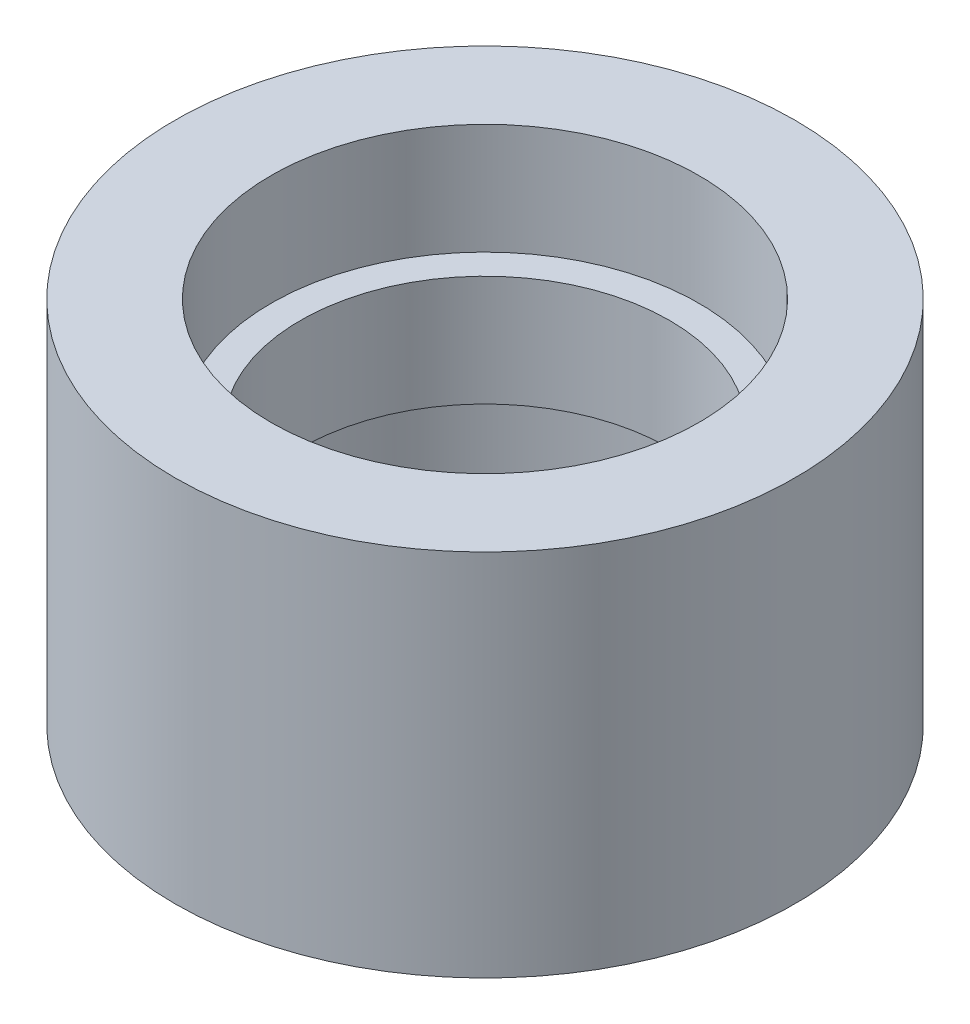
ISO-10303-21;
HEADER;
FILE_DESCRIPTION(('STEP AP214'),'2;1');
FILE_NAME('part.step','',(''),(''),'','','');
FILE_SCHEMA(('AUTOMOTIVE_DESIGN { 1 0 10303 214 1 1 1 1 }'));
ENDSEC;
DATA;
#1=APPLICATION_CONTEXT('core data for automotive mechanical design processes');
#2=APPLICATION_PROTOCOL_DEFINITION('international standard','automotive_design',2000,#1);
#3=PRODUCT_CONTEXT('',#1,'mechanical');
#4=PRODUCT('Part','Part','',(#3));
#5=PRODUCT_RELATED_PRODUCT_CATEGORY('part','',(#4));
#6=PRODUCT_DEFINITION_FORMATION('','',#4);
#7=PRODUCT_DEFINITION_CONTEXT('part definition',#1,'design');
#8=PRODUCT_DEFINITION('design','',#6,#7);
#9=PRODUCT_DEFINITION_SHAPE('','',#8);
#10=(LENGTH_UNIT() NAMED_UNIT(*) SI_UNIT(.MILLI.,.METRE.));
#11=(NAMED_UNIT(*) PLANE_ANGLE_UNIT() SI_UNIT($,.RADIAN.));
#12=(NAMED_UNIT(*) SI_UNIT($,.STERADIAN.) SOLID_ANGLE_UNIT());
#13=UNCERTAINTY_MEASURE_WITH_UNIT(LENGTH_MEASURE(1.E-05),#10,'distance_accuracy_value','');
#14=(GEOMETRIC_REPRESENTATION_CONTEXT(3) GLOBAL_UNCERTAINTY_ASSIGNED_CONTEXT((#13)) GLOBAL_UNIT_ASSIGNED_CONTEXT((#10,
#11,#12)) REPRESENTATION_CONTEXT('',''));
#15=CARTESIAN_POINT('',(0.,0.,0.));
#16=DIRECTION('',(0.,0.,1.));
#17=DIRECTION('',(1.,0.,0.));
#18=AXIS2_PLACEMENT_3D('',#15,#16,#17);
#19=CARTESIAN_POINT('',(0.,20.,0.));
#20=DIRECTION('',(0.,-1.,0.));
#21=DIRECTION('',(0.,0.,-1.));
#22=AXIS2_PLACEMENT_3D('',#19,#20,#21);
#23=CYLINDRICAL_SURFACE('',#22,29.);
#24=CARTESIAN_POINT('',(0.,20.,0.));
#25=DIRECTION('',(0.,-1.,0.));
#26=DIRECTION('',(0.,0.,-1.));
#27=AXIS2_PLACEMENT_3D('',#24,#25,#26);
#28=CIRCLE('',#27,29.);
#29=CARTESIAN_POINT('',(0.,20.,-29.));
#30=VERTEX_POINT('',#29);
#31=EDGE_CURVE('E104',#30,#30,#28,.T.);
#32=ORIENTED_EDGE('',*,*,#31,.F.);
#33=EDGE_LOOP('',(#32));
#34=FACE_BOUND('',#33,.T.);
#35=CARTESIAN_POINT('',(0.,9.,0.));
#36=DIRECTION('',(0.,-1.,0.));
#37=DIRECTION('',(0.,0.,-1.));
#38=AXIS2_PLACEMENT_3D('',#35,#36,#37);
#39=CIRCLE('',#38,29.);
#40=CARTESIAN_POINT('',(0.,9.,-29.));
#41=VERTEX_POINT('',#40);
#42=EDGE_CURVE('E46',#41,#41,#39,.F.);
#43=ORIENTED_EDGE('',*,*,#42,.F.);
#44=EDGE_LOOP('',(#43));
#45=FACE_BOUND('',#44,.T.);
#46=ADVANCED_FACE('F42',(#34,#45),#23,.F.);
#47=CARTESIAN_POINT('',(0.,50.,0.));
#48=DIRECTION('',(0.,-1.,0.));
#49=DIRECTION('',(0.,0.,-1.));
#50=AXIS2_PLACEMENT_3D('',#47,#48,#49);
#51=CYLINDRICAL_SURFACE('',#50,25.);
#52=CARTESIAN_POINT('',(0.,35.,0.));
#53=DIRECTION('',(0.,1.,0.));
#54=DIRECTION('',(0.,0.,1.));
#55=AXIS2_PLACEMENT_3D('',#52,#53,#54);
#56=CIRCLE('',#55,25.);
#57=CARTESIAN_POINT('',(0.,35.,25.));
#58=VERTEX_POINT('',#57);
#59=EDGE_CURVE('E111',#58,#58,#56,.T.);
#60=ORIENTED_EDGE('',*,*,#59,.T.);
#61=EDGE_LOOP('',(#60));
#62=FACE_BOUND('',#61,.T.);
#63=CARTESIAN_POINT('',(0.,20.,0.));
#64=DIRECTION('',(0.,-1.,0.));
#65=DIRECTION('',(0.,0.,-1.));
#66=AXIS2_PLACEMENT_3D('',#63,#64,#65);
#67=CIRCLE('',#66,25.);
#68=CARTESIAN_POINT('',(0.,20.,-25.));
#69=VERTEX_POINT('',#68);
#70=EDGE_CURVE('E107',#69,#69,#67,.T.);
#71=ORIENTED_EDGE('',*,*,#70,.T.);
#72=EDGE_LOOP('',(#71));
#73=FACE_BOUND('',#72,.T.);
#74=ADVANCED_FACE('F121',(#62,#73),#51,.F.);
#75=CARTESIAN_POINT('',(0.,50.,0.));
#76=DIRECTION('',(0.,1.,0.));
#77=DIRECTION('',(0.,0.,1.));
#78=AXIS2_PLACEMENT_3D('',#75,#76,#77);
#79=PLANE('',#78);
#80=CARTESIAN_POINT('',(0.,50.,0.));
#81=DIRECTION('',(0.,1.,0.));
#82=DIRECTION('',(0.,0.,1.));
#83=AXIS2_PLACEMENT_3D('',#80,#81,#82);
#84=CIRCLE('',#83,29.);
#85=CARTESIAN_POINT('',(0.,50.,29.));
#86=VERTEX_POINT('',#85);
#87=EDGE_CURVE('E112',#86,#86,#84,.T.);
#88=ORIENTED_EDGE('',*,*,#87,.F.);
#89=EDGE_LOOP('',(#88));
#90=FACE_BOUND('',#89,.T.);
#91=CARTESIAN_POINT('',(0.,50.,0.));
#92=DIRECTION('',(0.,1.,0.));
#93=DIRECTION('',(0.,0.,1.));
#94=AXIS2_PLACEMENT_3D('',#91,#92,#93);
#95=CIRCLE('',#94,42.);
#96=CARTESIAN_POINT('',(0.,50.,42.));
#97=VERTEX_POINT('',#96);
#98=EDGE_CURVE('E11',#97,#97,#95,.T.);
#99=ORIENTED_EDGE('',*,*,#98,.T.);
#100=EDGE_LOOP('',(#99));
#101=FACE_BOUND('',#100,.T.);
#102=ADVANCED_FACE('F159',(#90,#101),#79,.T.);
#103=CARTESIAN_POINT('',(0.,0.,0.));
#104=DIRECTION('',(0.,1.,0.));
#105=DIRECTION('',(0.,0.,1.));
#106=AXIS2_PLACEMENT_3D('',#103,#104,#105);
#107=PLANE('',#106);
#108=CARTESIAN_POINT('',(-24.,0.,24.));
#109=DIRECTION('',(0.,-1.,0.));
#110=DIRECTION('',(0.,0.,-1.));
#111=AXIS2_PLACEMENT_3D('',#108,#109,#110);
#112=CIRCLE('',#111,1.65);
#113=CARTESIAN_POINT('',(-24.,0.,22.35));
#114=VERTEX_POINT('',#113);
#115=EDGE_CURVE('E76',#114,#114,#112,.T.);
#116=ORIENTED_EDGE('',*,*,#115,.F.);
#117=EDGE_LOOP('',(#116));
#118=FACE_BOUND('',#117,.T.);
#119=CARTESIAN_POINT('',(24.,0.,24.));
#120=DIRECTION('',(0.,-1.,0.));
#121=DIRECTION('',(0.,0.,-1.));
#122=AXIS2_PLACEMENT_3D('',#119,#120,#121);
#123=CIRCLE('',#122,1.65);
#124=CARTESIAN_POINT('',(24.,0.,22.35));
#125=VERTEX_POINT('',#124);
#126=EDGE_CURVE('E75',#125,#125,#123,.T.);
#127=ORIENTED_EDGE('',*,*,#126,.F.);
#128=EDGE_LOOP('',(#127));
#129=FACE_BOUND('',#128,.T.);
#130=CARTESIAN_POINT('',(-24.,0.,-24.));
#131=DIRECTION('',(0.,-1.,0.));
#132=DIRECTION('',(0.,0.,-1.));
#133=AXIS2_PLACEMENT_3D('',#130,#131,#132);
#134=CIRCLE('',#133,1.65);
#135=CARTESIAN_POINT('',(-24.,0.,-25.65));
#136=VERTEX_POINT('',#135);
#137=EDGE_CURVE('E86',#136,#136,#134,.T.);
#138=ORIENTED_EDGE('',*,*,#137,.F.);
#139=EDGE_LOOP('',(#138));
#140=FACE_BOUND('',#139,.T.);
#141=CARTESIAN_POINT('',(24.,0.,-24.));
#142=DIRECTION('',(0.,-1.,0.));
#143=DIRECTION('',(0.,0.,-1.));
#144=AXIS2_PLACEMENT_3D('',#141,#142,#143);
#145=CIRCLE('',#144,1.65);
#146=CARTESIAN_POINT('',(24.,0.,-25.65));
#147=VERTEX_POINT('',#146);
#148=EDGE_CURVE('E92',#147,#147,#145,.T.);
#149=ORIENTED_EDGE('',*,*,#148,.F.);
#150=EDGE_LOOP('',(#149));
#151=FACE_BOUND('',#150,.T.);
#152=CARTESIAN_POINT('',(0.,0.,0.));
#153=DIRECTION('',(0.,-1.,0.));
#154=DIRECTION('',(0.,0.,-1.));
#155=AXIS2_PLACEMENT_3D('',#152,#153,#154);
#156=CIRCLE('',#155,31.);
#157=CARTESIAN_POINT('',(0.,0.,-31.));
#158=VERTEX_POINT('',#157);
#159=EDGE_CURVE('E98',#158,#158,#156,.T.);
#160=ORIENTED_EDGE('',*,*,#159,.F.);
#161=EDGE_LOOP('',(#160));
#162=FACE_BOUND('',#161,.T.);
#163=CARTESIAN_POINT('',(0.,0.,0.));
#164=DIRECTION('',(0.,1.,0.));
#165=DIRECTION('',(0.,0.,1.));
#166=AXIS2_PLACEMENT_3D('',#163,#164,#165);
#167=CIRCLE('',#166,42.);
#168=CARTESIAN_POINT('',(0.,0.,42.));
#169=VERTEX_POINT('',#168);
#170=EDGE_CURVE('E51',#169,#169,#167,.T.);
#171=ORIENTED_EDGE('',*,*,#170,.F.);
#172=EDGE_LOOP('',(#171));
#173=FACE_BOUND('',#172,.T.);
#174=ADVANCED_FACE('F162',(#118,#129,#140,#151,#162,#173),#107,.F.);
#175=CARTESIAN_POINT('',(0.,50.,0.));
#176=DIRECTION('',(0.,-1.,0.));
#177=DIRECTION('',(0.,0.,-1.));
#178=AXIS2_PLACEMENT_3D('',#175,#176,#177);
#179=CYLINDRICAL_SURFACE('',#178,42.);
#180=ORIENTED_EDGE('',*,*,#98,.F.);
#181=EDGE_LOOP('',(#180));
#182=FACE_BOUND('',#181,.T.);
#183=ORIENTED_EDGE('',*,*,#170,.T.);
#184=EDGE_LOOP('',(#183));
#185=FACE_BOUND('',#184,.T.);
#186=ADVANCED_FACE('F44',(#182,#185),#179,.T.);
#187=CARTESIAN_POINT('',(0.,35.,0.));
#188=DIRECTION('',(0.,1.,0.));
#189=DIRECTION('',(0.,0.,1.));
#190=AXIS2_PLACEMENT_3D('',#187,#188,#189);
#191=CYLINDRICAL_SURFACE('',#190,29.);
#192=CARTESIAN_POINT('',(0.,35.,0.));
#193=DIRECTION('',(0.,1.,0.));
#194=DIRECTION('',(0.,0.,1.));
#195=AXIS2_PLACEMENT_3D('',#192,#193,#194);
#196=CIRCLE('',#195,29.);
#197=CARTESIAN_POINT('',(0.,35.,29.));
#198=VERTEX_POINT('',#197);
#199=EDGE_CURVE('E108',#198,#198,#196,.T.);
#200=ORIENTED_EDGE('',*,*,#199,.F.);
#201=EDGE_LOOP('',(#200));
#202=FACE_BOUND('',#201,.T.);
#203=ORIENTED_EDGE('',*,*,#87,.T.);
#204=EDGE_LOOP('',(#203));
#205=FACE_BOUND('',#204,.T.);
#206=ADVANCED_FACE('F152',(#202,#205),#191,.F.);
#207=CARTESIAN_POINT('',(0.,35.,0.));
#208=DIRECTION('',(0.,1.,0.));
#209=DIRECTION('',(0.,0.,1.));
#210=AXIS2_PLACEMENT_3D('',#207,#208,#209);
#211=PLANE('',#210);
#212=ORIENTED_EDGE('',*,*,#59,.F.);
#213=EDGE_LOOP('',(#212));
#214=FACE_BOUND('',#213,.T.);
#215=ORIENTED_EDGE('',*,*,#199,.T.);
#216=EDGE_LOOP('',(#215));
#217=FACE_BOUND('',#216,.T.);
#218=ADVANCED_FACE('F127',(#214,#217),#211,.T.);
#219=CARTESIAN_POINT('',(0.,20.,0.));
#220=DIRECTION('',(0.,-1.,0.));
#221=DIRECTION('',(0.,0.,-1.));
#222=AXIS2_PLACEMENT_3D('',#219,#220,#221);
#223=PLANE('',#222);
#224=ORIENTED_EDGE('',*,*,#70,.F.);
#225=EDGE_LOOP('',(#224));
#226=FACE_BOUND('',#225,.T.);
#227=ORIENTED_EDGE('',*,*,#31,.T.);
#228=EDGE_LOOP('',(#227));
#229=FACE_BOUND('',#228,.T.);
#230=ADVANCED_FACE('F123',(#226,#229),#223,.T.);
#231=CARTESIAN_POINT('',(0.,9.,0.));
#232=DIRECTION('',(0.,-1.,0.));
#233=DIRECTION('',(0.,0.,-1.));
#234=AXIS2_PLACEMENT_3D('',#231,#232,#233);
#235=PLANE('',#234);
#236=CARTESIAN_POINT('',(0.,9.,0.));
#237=DIRECTION('',(0.,-1.,0.));
#238=DIRECTION('',(0.,0.,-1.));
#239=AXIS2_PLACEMENT_3D('',#236,#237,#238);
#240=CIRCLE('',#239,31.);
#241=CARTESIAN_POINT('',(0.,9.,-31.));
#242=VERTEX_POINT('',#241);
#243=EDGE_CURVE('E99',#242,#242,#240,.T.);
#244=ORIENTED_EDGE('',*,*,#243,.T.);
#245=EDGE_LOOP('',(#244));
#246=FACE_BOUND('',#245,.T.);
#247=ORIENTED_EDGE('',*,*,#42,.T.);
#248=EDGE_LOOP('',(#247));
#249=FACE_BOUND('',#248,.T.);
#250=ADVANCED_FACE('F126',(#246,#249),#235,.T.);
#251=CARTESIAN_POINT('',(0.,9.,0.));
#252=DIRECTION('',(0.,-1.,0.));
#253=DIRECTION('',(0.,0.,-1.));
#254=AXIS2_PLACEMENT_3D('',#251,#252,#253);
#255=CYLINDRICAL_SURFACE('',#254,31.);
#256=ORIENTED_EDGE('',*,*,#243,.F.);
#257=EDGE_LOOP('',(#256));
#258=FACE_BOUND('',#257,.T.);
#259=ORIENTED_EDGE('',*,*,#159,.T.);
#260=EDGE_LOOP('',(#259));
#261=FACE_BOUND('',#260,.T.);
#262=ADVANCED_FACE('F138',(#258,#261),#255,.F.);
#263=CARTESIAN_POINT('',(24.,10.1,-24.));
#264=DIRECTION('',(0.,-1.,0.));
#265=DIRECTION('',(0.,0.,-1.));
#266=AXIS2_PLACEMENT_3D('',#263,#264,#265);
#267=CONICAL_SURFACE('',#266,1.65,1.02974425867665);
#268=CARTESIAN_POINT('',(24.,11.0914200213955,-24.));
#269=VERTEX_POINT('',#268);
#270=VERTEX_LOOP('',#269);
#271=FACE_BOUND('',#270,.T.);
#272=CARTESIAN_POINT('',(24.,10.1,-24.));
#273=DIRECTION('',(0.,-1.,0.));
#274=DIRECTION('',(0.,0.,-1.));
#275=AXIS2_PLACEMENT_3D('',#272,#273,#274);
#276=CIRCLE('',#275,1.65);
#277=CARTESIAN_POINT('',(24.,10.1,-25.65));
#278=VERTEX_POINT('',#277);
#279=EDGE_CURVE('E95',#278,#278,#276,.T.);
#280=ORIENTED_EDGE('',*,*,#279,.T.);
#281=EDGE_LOOP('',(#280));
#282=FACE_BOUND('',#281,.T.);
#283=ADVANCED_FACE('F144',(#271,#282),#267,.F.);
#284=CARTESIAN_POINT('',(24.,0.,-24.));
#285=DIRECTION('',(0.,-1.,0.));
#286=DIRECTION('',(0.,0.,-1.));
#287=AXIS2_PLACEMENT_3D('',#284,#285,#286);
#288=CYLINDRICAL_SURFACE('',#287,1.65);
#289=ORIENTED_EDGE('',*,*,#279,.F.);
#290=EDGE_LOOP('',(#289));
#291=FACE_BOUND('',#290,.T.);
#292=ORIENTED_EDGE('',*,*,#148,.T.);
#293=EDGE_LOOP('',(#292));
#294=FACE_BOUND('',#293,.T.);
#295=ADVANCED_FACE('F184',(#291,#294),#288,.F.);
#296=CARTESIAN_POINT('',(-24.,10.1,-24.));
#297=DIRECTION('',(0.,-1.,0.));
#298=DIRECTION('',(0.,0.,-1.));
#299=AXIS2_PLACEMENT_3D('',#296,#297,#298);
#300=CONICAL_SURFACE('',#299,1.65,1.02974425867665);
#301=CARTESIAN_POINT('',(-24.,11.0914200213955,-24.));
#302=VERTEX_POINT('',#301);
#303=VERTEX_LOOP('',#302);
#304=FACE_BOUND('',#303,.T.);
#305=CARTESIAN_POINT('',(-24.,10.1,-24.));
#306=DIRECTION('',(0.,-1.,0.));
#307=DIRECTION('',(0.,0.,-1.));
#308=AXIS2_PLACEMENT_3D('',#305,#306,#307);
#309=CIRCLE('',#308,1.65);
#310=CARTESIAN_POINT('',(-24.,10.1,-25.65));
#311=VERTEX_POINT('',#310);
#312=EDGE_CURVE('E89',#311,#311,#309,.T.);
#313=ORIENTED_EDGE('',*,*,#312,.T.);
#314=EDGE_LOOP('',(#313));
#315=FACE_BOUND('',#314,.T.);
#316=ADVANCED_FACE('F186',(#304,#315),#300,.F.);
#317=CARTESIAN_POINT('',(-24.,0.,-24.));
#318=DIRECTION('',(0.,-1.,0.));
#319=DIRECTION('',(0.,0.,-1.));
#320=AXIS2_PLACEMENT_3D('',#317,#318,#319);
#321=CYLINDRICAL_SURFACE('',#320,1.65);
#322=ORIENTED_EDGE('',*,*,#312,.F.);
#323=EDGE_LOOP('',(#322));
#324=FACE_BOUND('',#323,.T.);
#325=ORIENTED_EDGE('',*,*,#137,.T.);
#326=EDGE_LOOP('',(#325));
#327=FACE_BOUND('',#326,.T.);
#328=ADVANCED_FACE('F192',(#324,#327),#321,.F.);
#329=CARTESIAN_POINT('',(24.,10.1,24.));
#330=DIRECTION('',(0.,-1.,0.));
#331=DIRECTION('',(0.,0.,-1.));
#332=AXIS2_PLACEMENT_3D('',#329,#330,#331);
#333=CONICAL_SURFACE('',#332,1.65,1.02974425867665);
#334=CARTESIAN_POINT('',(24.,11.0914200213955,24.));
#335=VERTEX_POINT('',#334);
#336=VERTEX_LOOP('',#335);
#337=FACE_BOUND('',#336,.T.);
#338=CARTESIAN_POINT('',(24.,10.1,24.));
#339=DIRECTION('',(0.,-1.,0.));
#340=DIRECTION('',(0.,0.,-1.));
#341=AXIS2_PLACEMENT_3D('',#338,#339,#340);
#342=CIRCLE('',#341,1.65);
#343=CARTESIAN_POINT('',(24.,10.1,22.35));
#344=VERTEX_POINT('',#343);
#345=EDGE_CURVE('E79',#344,#344,#342,.T.);
#346=ORIENTED_EDGE('',*,*,#345,.T.);
#347=EDGE_LOOP('',(#346));
#348=FACE_BOUND('',#347,.T.);
#349=ADVANCED_FACE('F198',(#337,#348),#333,.F.);
#350=CARTESIAN_POINT('',(24.,0.,24.));
#351=DIRECTION('',(0.,-1.,0.));
#352=DIRECTION('',(0.,0.,-1.));
#353=AXIS2_PLACEMENT_3D('',#350,#351,#352);
#354=CYLINDRICAL_SURFACE('',#353,1.65);
#355=ORIENTED_EDGE('',*,*,#345,.F.);
#356=EDGE_LOOP('',(#355));
#357=FACE_BOUND('',#356,.T.);
#358=ORIENTED_EDGE('',*,*,#126,.T.);
#359=EDGE_LOOP('',(#358));
#360=FACE_BOUND('',#359,.T.);
#361=ADVANCED_FACE('F69',(#357,#360),#354,.F.);
#362=CARTESIAN_POINT('',(-24.,10.1,24.));
#363=DIRECTION('',(0.,-1.,0.));
#364=DIRECTION('',(0.,0.,-1.));
#365=AXIS2_PLACEMENT_3D('',#362,#363,#364);
#366=CONICAL_SURFACE('',#365,1.65,1.02974425867665);
#367=CARTESIAN_POINT('',(-24.,11.0914200213955,24.));
#368=VERTEX_POINT('',#367);
#369=VERTEX_LOOP('',#368);
#370=FACE_BOUND('',#369,.T.);
#371=CARTESIAN_POINT('',(-24.,10.1,24.));
#372=DIRECTION('',(0.,-1.,0.));
#373=DIRECTION('',(0.,0.,-1.));
#374=AXIS2_PLACEMENT_3D('',#371,#372,#373);
#375=CIRCLE('',#374,1.65);
#376=CARTESIAN_POINT('',(-24.,10.1,22.35));
#377=VERTEX_POINT('',#376);
#378=EDGE_CURVE('E73',#377,#377,#375,.T.);
#379=ORIENTED_EDGE('',*,*,#378,.T.);
#380=EDGE_LOOP('',(#379));
#381=FACE_BOUND('',#380,.T.);
#382=ADVANCED_FACE('F65',(#370,#381),#366,.F.);
#383=CARTESIAN_POINT('',(-24.,0.,24.));
#384=DIRECTION('',(0.,-1.,0.));
#385=DIRECTION('',(0.,0.,-1.));
#386=AXIS2_PLACEMENT_3D('',#383,#384,#385);
#387=CYLINDRICAL_SURFACE('',#386,1.65);
#388=ORIENTED_EDGE('',*,*,#378,.F.);
#389=EDGE_LOOP('',(#388));
#390=FACE_BOUND('',#389,.T.);
#391=ORIENTED_EDGE('',*,*,#115,.T.);
#392=EDGE_LOOP('',(#391));
#393=FACE_BOUND('',#392,.T.);
#394=ADVANCED_FACE('F68',(#390,#393),#387,.F.);
#395=CLOSED_SHELL('',(#46,#74,#102,#174,#186,#206,#218,#230,#250,#262,#283,#295,#316,#328,#349,
#361,#382,#394));
#396=MANIFOLD_SOLID_BREP('B2',#395);
#397=ADVANCED_BREP_SHAPE_REPRESENTATION('',(#18,#396),#14);
#398=SHAPE_DEFINITION_REPRESENTATION(#9,#397);
ENDSEC;
END-ISO-10303-21;
